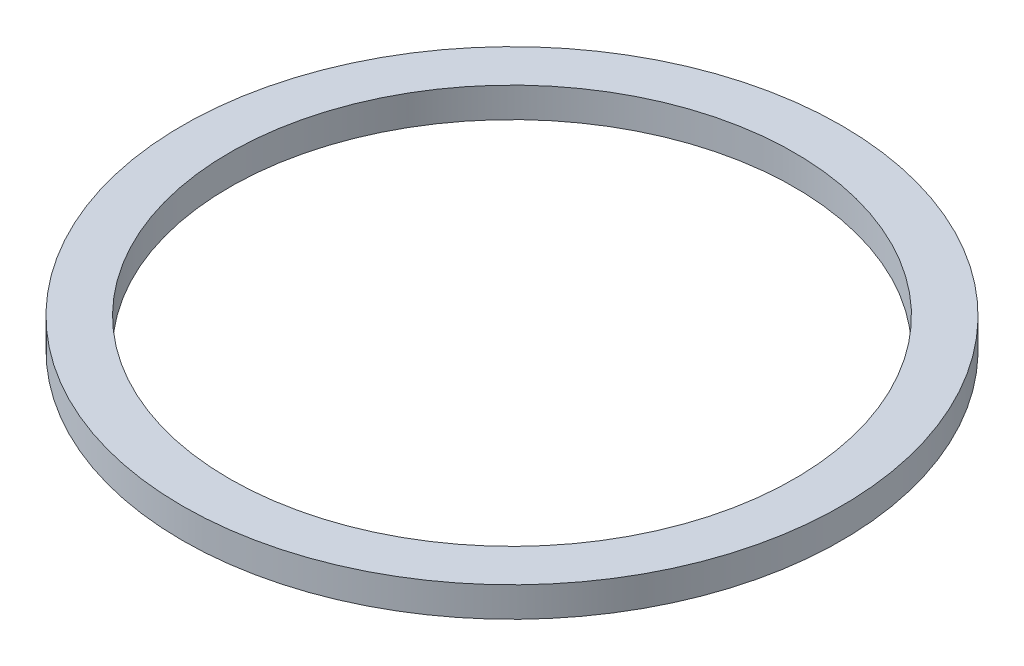
ISO-10303-21;
HEADER;
FILE_DESCRIPTION(('STEP AP214'),'2;1');
FILE_NAME('part.step','',(''),(''),'','','');
FILE_SCHEMA(('AUTOMOTIVE_DESIGN { 1 0 10303 214 1 1 1 1 }'));
ENDSEC;
DATA;
#1=APPLICATION_CONTEXT('core data for automotive mechanical design processes');
#2=APPLICATION_PROTOCOL_DEFINITION('international standard','automotive_design',2000,#1);
#3=PRODUCT_CONTEXT('',#1,'mechanical');
#4=PRODUCT('Part','Part','',(#3));
#5=PRODUCT_RELATED_PRODUCT_CATEGORY('part','',(#4));
#6=PRODUCT_DEFINITION_FORMATION('','',#4);
#7=PRODUCT_DEFINITION_CONTEXT('part definition',#1,'design');
#8=PRODUCT_DEFINITION('design','',#6,#7);
#9=PRODUCT_DEFINITION_SHAPE('','',#8);
#10=(LENGTH_UNIT() NAMED_UNIT(*) SI_UNIT(.MILLI.,.METRE.));
#11=(NAMED_UNIT(*) PLANE_ANGLE_UNIT() SI_UNIT($,.RADIAN.));
#12=(NAMED_UNIT(*) SI_UNIT($,.STERADIAN.) SOLID_ANGLE_UNIT());
#13=UNCERTAINTY_MEASURE_WITH_UNIT(LENGTH_MEASURE(1.E-05),#10,'distance_accuracy_value','');
#14=(GEOMETRIC_REPRESENTATION_CONTEXT(3) GLOBAL_UNCERTAINTY_ASSIGNED_CONTEXT((#13)) GLOBAL_UNIT_ASSIGNED_CONTEXT((#10,
#11,#12)) REPRESENTATION_CONTEXT('',''));
#15=CARTESIAN_POINT('',(0.,0.,0.));
#16=DIRECTION('',(0.,0.,1.));
#17=DIRECTION('',(1.,0.,0.));
#18=AXIS2_PLACEMENT_3D('',#15,#16,#17);
#19=CARTESIAN_POINT('',(0.,1.5875,0.));
#20=DIRECTION('',(0.,1.,0.));
#21=DIRECTION('',(0.,0.,1.));
#22=AXIS2_PLACEMENT_3D('',#19,#20,#21);
#23=PLANE('',#22);
#24=CARTESIAN_POINT('',(0.,1.5875,0.));
#25=DIRECTION('',(0.,1.,0.));
#26=DIRECTION('',(0.,0.,1.));
#27=AXIS2_PLACEMENT_3D('',#24,#25,#26);
#28=CIRCLE('',#27,17.5);
#29=CARTESIAN_POINT('',(0.,1.5875,17.5));
#30=VERTEX_POINT('',#29);
#31=EDGE_CURVE('E10',#30,#30,#28,.T.);
#32=ORIENTED_EDGE('',*,*,#31,.T.);
#33=EDGE_LOOP('',(#32));
#34=FACE_BOUND('',#33,.T.);
#35=CARTESIAN_POINT('',(0.,1.5875,0.));
#36=DIRECTION('',(0.,1.,0.));
#37=DIRECTION('',(0.,0.,1.));
#38=AXIS2_PLACEMENT_3D('',#35,#36,#37);
#39=CIRCLE('',#38,15.);
#40=CARTESIAN_POINT('',(0.,1.5875,15.));
#41=VERTEX_POINT('',#40);
#42=EDGE_CURVE('E48',#41,#41,#39,.T.);
#43=ORIENTED_EDGE('',*,*,#42,.F.);
#44=EDGE_LOOP('',(#43));
#45=FACE_BOUND('',#44,.T.);
#46=ADVANCED_FACE('F37',(#34,#45),#23,.T.);
#47=CARTESIAN_POINT('',(0.,0.,0.));
#48=DIRECTION('',(0.,1.,0.));
#49=DIRECTION('',(0.,0.,1.));
#50=AXIS2_PLACEMENT_3D('',#47,#48,#49);
#51=PLANE('',#50);
#52=CARTESIAN_POINT('',(0.,0.,0.));
#53=DIRECTION('',(0.,1.,0.));
#54=DIRECTION('',(0.,0.,1.));
#55=AXIS2_PLACEMENT_3D('',#52,#53,#54);
#56=CIRCLE('',#55,17.5);
#57=CARTESIAN_POINT('',(0.,0.,17.5));
#58=VERTEX_POINT('',#57);
#59=EDGE_CURVE('E41',#58,#58,#56,.T.);
#60=ORIENTED_EDGE('',*,*,#59,.F.);
#61=EDGE_LOOP('',(#60));
#62=FACE_BOUND('',#61,.T.);
#63=CARTESIAN_POINT('',(0.,0.,0.));
#64=DIRECTION('',(0.,1.,0.));
#65=DIRECTION('',(0.,0.,1.));
#66=AXIS2_PLACEMENT_3D('',#63,#64,#65);
#67=CIRCLE('',#66,15.);
#68=CARTESIAN_POINT('',(0.,0.,15.));
#69=VERTEX_POINT('',#68);
#70=EDGE_CURVE('E50',#69,#69,#67,.T.);
#71=ORIENTED_EDGE('',*,*,#70,.T.);
#72=EDGE_LOOP('',(#71));
#73=FACE_BOUND('',#72,.T.);
#74=ADVANCED_FACE('F60',(#62,#73),#51,.F.);
#75=CARTESIAN_POINT('',(0.,1.5875,0.));
#76=DIRECTION('',(0.,-1.,0.));
#77=DIRECTION('',(0.,0.,-1.));
#78=AXIS2_PLACEMENT_3D('',#75,#76,#77);
#79=CYLINDRICAL_SURFACE('',#78,17.5);
#80=ORIENTED_EDGE('',*,*,#31,.F.);
#81=EDGE_LOOP('',(#80));
#82=FACE_BOUND('',#81,.T.);
#83=ORIENTED_EDGE('',*,*,#59,.T.);
#84=EDGE_LOOP('',(#83));
#85=FACE_BOUND('',#84,.T.);
#86=ADVANCED_FACE('F39',(#82,#85),#79,.T.);
#87=CARTESIAN_POINT('',(0.,1.5875,0.));
#88=DIRECTION('',(0.,-1.,0.));
#89=DIRECTION('',(0.,0.,-1.));
#90=AXIS2_PLACEMENT_3D('',#87,#88,#89);
#91=CYLINDRICAL_SURFACE('',#90,15.);
#92=ORIENTED_EDGE('',*,*,#42,.T.);
#93=EDGE_LOOP('',(#92));
#94=FACE_BOUND('',#93,.T.);
#95=ORIENTED_EDGE('',*,*,#70,.F.);
#96=EDGE_LOOP('',(#95));
#97=FACE_BOUND('',#96,.T.);
#98=ADVANCED_FACE('F56',(#94,#97),#91,.F.);
#99=CLOSED_SHELL('',(#46,#74,#86,#98));
#100=MANIFOLD_SOLID_BREP('B2',#99);
#101=ADVANCED_BREP_SHAPE_REPRESENTATION('',(#18,#100),#14);
#102=SHAPE_DEFINITION_REPRESENTATION(#9,#101);
ENDSEC;
END-ISO-10303-21;
